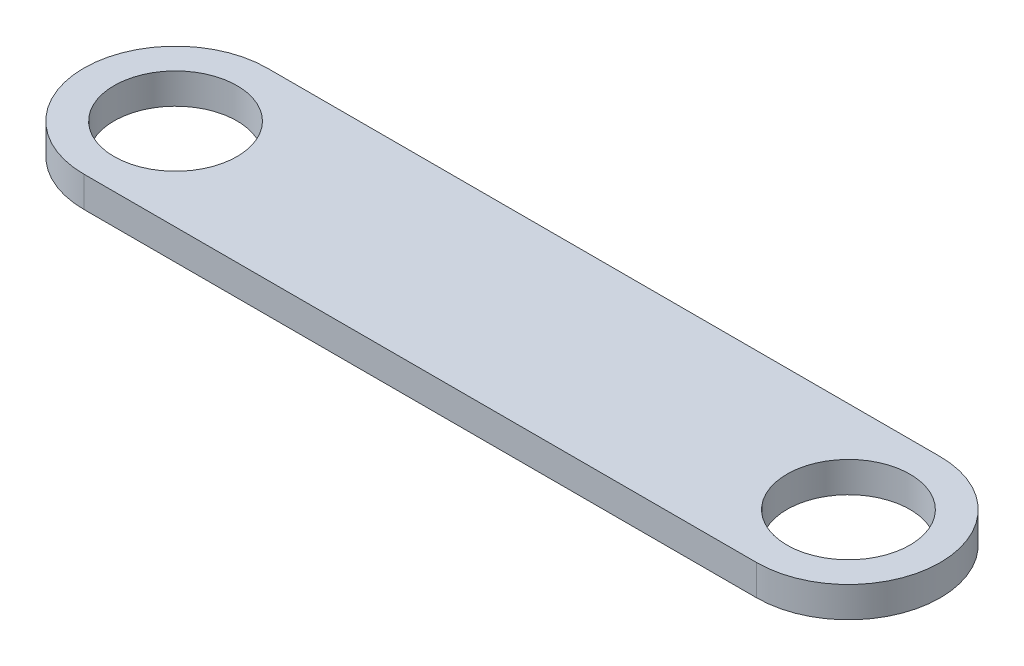
ISO-10303-21;
HEADER;
FILE_DESCRIPTION(('STEP AP214'),'2;1');
FILE_NAME('part.step','',(''),(''),'','','');
FILE_SCHEMA(('AUTOMOTIVE_DESIGN { 1 0 10303 214 1 1 1 1 }'));
ENDSEC;
DATA;
#1=APPLICATION_CONTEXT('core data for automotive mechanical design processes');
#2=APPLICATION_PROTOCOL_DEFINITION('international standard','automotive_design',2000,#1);
#3=PRODUCT_CONTEXT('',#1,'mechanical');
#4=PRODUCT('Part','Part','',(#3));
#5=PRODUCT_RELATED_PRODUCT_CATEGORY('part','',(#4));
#6=PRODUCT_DEFINITION_FORMATION('','',#4);
#7=PRODUCT_DEFINITION_CONTEXT('part definition',#1,'design');
#8=PRODUCT_DEFINITION('design','',#6,#7);
#9=PRODUCT_DEFINITION_SHAPE('','',#8);
#10=(LENGTH_UNIT() NAMED_UNIT(*) SI_UNIT(.MILLI.,.METRE.));
#11=(NAMED_UNIT(*) PLANE_ANGLE_UNIT() SI_UNIT($,.RADIAN.));
#12=(NAMED_UNIT(*) SI_UNIT($,.STERADIAN.) SOLID_ANGLE_UNIT());
#13=UNCERTAINTY_MEASURE_WITH_UNIT(LENGTH_MEASURE(1.E-05),#10,'distance_accuracy_value','');
#14=(GEOMETRIC_REPRESENTATION_CONTEXT(3) GLOBAL_UNCERTAINTY_ASSIGNED_CONTEXT((#13)) GLOBAL_UNIT_ASSIGNED_CONTEXT((#10,
#11,#12)) REPRESENTATION_CONTEXT('',''));
#15=CARTESIAN_POINT('',(0.,0.,0.));
#16=DIRECTION('',(0.,0.,1.));
#17=DIRECTION('',(1.,0.,0.));
#18=AXIS2_PLACEMENT_3D('',#15,#16,#17);
#19=CARTESIAN_POINT('',(0.,2.5,7.49999999999999));
#20=DIRECTION('',(0.,0.,-1.));
#21=DIRECTION('',(-1.,0.,0.));
#22=AXIS2_PLACEMENT_3D('',#19,#20,#21);
#23=PLANE('',#22);
#24=DIRECTION('',(1.,0.,0.));
#25=VECTOR('',#24,1.);
#26=CARTESIAN_POINT('',(0.,0.,7.49999999999999));
#27=LINE('',#26,#25);
#28=CARTESIAN_POINT('',(-27.5,0.,7.5));
#29=VERTEX_POINT('',#28);
#30=CARTESIAN_POINT('',(27.5,0.,7.49999999999999));
#31=VERTEX_POINT('',#30);
#32=EDGE_CURVE('E121',#29,#31,#27,.T.);
#33=ORIENTED_EDGE('',*,*,#32,.T.);
#34=DIRECTION('',(0.,-1.,0.));
#35=VECTOR('',#34,1.);
#36=CARTESIAN_POINT('',(27.5,2.5,7.49999999999999));
#37=LINE('',#36,#35);
#38=CARTESIAN_POINT('',(27.5,2.5,7.49999999999999));
#39=VERTEX_POINT('',#38);
#40=EDGE_CURVE('E11',#39,#31,#37,.T.);
#41=ORIENTED_EDGE('',*,*,#40,.F.);
#42=DIRECTION('',(1.,0.,0.));
#43=VECTOR('',#42,1.);
#44=CARTESIAN_POINT('',(0.,2.5,7.49999999999999));
#45=LINE('',#44,#43);
#46=CARTESIAN_POINT('',(-27.5,2.5,7.5));
#47=VERTEX_POINT('',#46);
#48=EDGE_CURVE('E94',#47,#39,#45,.T.);
#49=ORIENTED_EDGE('',*,*,#48,.F.);
#50=DIRECTION('',(0.,-1.,0.));
#51=VECTOR('',#50,1.);
#52=CARTESIAN_POINT('',(-27.5,2.5,7.5));
#53=LINE('',#52,#51);
#54=EDGE_CURVE('E109',#47,#29,#53,.T.);
#55=ORIENTED_EDGE('',*,*,#54,.T.);
#56=EDGE_LOOP('',(#33,#41,#49,#55));
#57=FACE_BOUND('',#56,.T.);
#58=ADVANCED_FACE('F45',(#57),#23,.F.);
#59=CARTESIAN_POINT('',(27.5,2.5,0.));
#60=DIRECTION('',(0.,-1.,0.));
#61=DIRECTION('',(0.,0.,-1.));
#62=AXIS2_PLACEMENT_3D('',#59,#60,#61);
#63=CYLINDRICAL_SURFACE('',#62,7.5);
#64=CARTESIAN_POINT('',(27.5,0.,0.));
#65=DIRECTION('',(0.,1.,0.));
#66=DIRECTION('',(0.,0.,1.));
#67=AXIS2_PLACEMENT_3D('',#64,#65,#66);
#68=CIRCLE('',#67,7.5);
#69=CARTESIAN_POINT('',(27.5,0.,-7.50000000000001));
#70=VERTEX_POINT('',#69);
#71=EDGE_CURVE('E100',#31,#70,#68,.T.);
#72=ORIENTED_EDGE('',*,*,#71,.T.);
#73=DIRECTION('',(0.,-1.,0.));
#74=VECTOR('',#73,1.);
#75=CARTESIAN_POINT('',(27.5,2.5,-7.50000000000001));
#76=LINE('',#75,#74);
#77=CARTESIAN_POINT('',(27.5,2.5,-7.50000000000001));
#78=VERTEX_POINT('',#77);
#79=EDGE_CURVE('E55',#78,#70,#76,.T.);
#80=ORIENTED_EDGE('',*,*,#79,.F.);
#81=CARTESIAN_POINT('',(27.5,2.5,0.));
#82=DIRECTION('',(0.,1.,0.));
#83=DIRECTION('',(0.,0.,1.));
#84=AXIS2_PLACEMENT_3D('',#81,#82,#83);
#85=CIRCLE('',#84,7.5);
#86=EDGE_CURVE('E89',#39,#78,#85,.T.);
#87=ORIENTED_EDGE('',*,*,#86,.F.);
#88=ORIENTED_EDGE('',*,*,#40,.T.);
#89=EDGE_LOOP('',(#72,#80,#87,#88));
#90=FACE_BOUND('',#89,.T.);
#91=ADVANCED_FACE('F99',(#90),#63,.T.);
#92=CARTESIAN_POINT('',(0.,2.5,-7.50000000000001));
#93=DIRECTION('',(0.,0.,-1.));
#94=DIRECTION('',(-1.,0.,0.));
#95=AXIS2_PLACEMENT_3D('',#92,#93,#94);
#96=PLANE('',#95);
#97=DIRECTION('',(1.,0.,0.));
#98=VECTOR('',#97,1.);
#99=CARTESIAN_POINT('',(0.,0.,-7.50000000000001));
#100=LINE('',#99,#98);
#101=CARTESIAN_POINT('',(-27.5,0.,-7.5));
#102=VERTEX_POINT('',#101);
#103=EDGE_CURVE('E127',#102,#70,#100,.T.);
#104=ORIENTED_EDGE('',*,*,#103,.F.);
#105=DIRECTION('',(0.,-1.,0.));
#106=VECTOR('',#105,1.);
#107=CARTESIAN_POINT('',(-27.5,2.5,-7.5));
#108=LINE('',#107,#106);
#109=CARTESIAN_POINT('',(-27.5,2.5,-7.5));
#110=VERTEX_POINT('',#109);
#111=EDGE_CURVE('E79',#110,#102,#108,.T.);
#112=ORIENTED_EDGE('',*,*,#111,.F.);
#113=DIRECTION('',(1.,0.,0.));
#114=VECTOR('',#113,1.);
#115=CARTESIAN_POINT('',(0.,2.5,-7.50000000000001));
#116=LINE('',#115,#114);
#117=EDGE_CURVE('E92',#110,#78,#116,.T.);
#118=ORIENTED_EDGE('',*,*,#117,.T.);
#119=ORIENTED_EDGE('',*,*,#79,.T.);
#120=EDGE_LOOP('',(#104,#112,#118,#119));
#121=FACE_BOUND('',#120,.T.);
#122=ADVANCED_FACE('F105',(#121),#96,.T.);
#123=CARTESIAN_POINT('',(-27.5,2.5,0.));
#124=DIRECTION('',(0.,-1.,0.));
#125=DIRECTION('',(0.,0.,-1.));
#126=AXIS2_PLACEMENT_3D('',#123,#124,#125);
#127=CYLINDRICAL_SURFACE('',#126,5.025);
#128=CARTESIAN_POINT('',(-27.5,2.5,0.));
#129=DIRECTION('',(0.,1.,0.));
#130=DIRECTION('',(0.,0.,1.));
#131=AXIS2_PLACEMENT_3D('',#128,#129,#130);
#132=CIRCLE('',#131,5.025);
#133=CARTESIAN_POINT('',(-27.5,2.5,5.025));
#134=VERTEX_POINT('',#133);
#135=EDGE_CURVE('E169',#134,#134,#132,.T.);
#136=ORIENTED_EDGE('',*,*,#135,.T.);
#137=EDGE_LOOP('',(#136));
#138=FACE_BOUND('',#137,.T.);
#139=CARTESIAN_POINT('',(-27.5,0.,0.));
#140=DIRECTION('',(0.,1.,0.));
#141=DIRECTION('',(0.,0.,1.));
#142=AXIS2_PLACEMENT_3D('',#139,#140,#141);
#143=CIRCLE('',#142,5.025);
#144=CARTESIAN_POINT('',(-27.5,0.,5.025));
#145=VERTEX_POINT('',#144);
#146=EDGE_CURVE('E117',#145,#145,#143,.T.);
#147=ORIENTED_EDGE('',*,*,#146,.F.);
#148=EDGE_LOOP('',(#147));
#149=FACE_BOUND('',#148,.T.);
#150=ADVANCED_FACE('F158',(#138,#149),#127,.F.);
#151=CARTESIAN_POINT('',(27.5,2.5,0.));
#152=DIRECTION('',(0.,-1.,0.));
#153=DIRECTION('',(0.,0.,-1.));
#154=AXIS2_PLACEMENT_3D('',#151,#152,#153);
#155=CYLINDRICAL_SURFACE('',#154,5.025);
#156=CARTESIAN_POINT('',(27.5,2.5,0.));
#157=DIRECTION('',(0.,1.,0.));
#158=DIRECTION('',(0.,0.,1.));
#159=AXIS2_PLACEMENT_3D('',#156,#157,#158);
#160=CIRCLE('',#159,5.025);
#161=CARTESIAN_POINT('',(27.5,2.5,5.02499999999999));
#162=VERTEX_POINT('',#161);
#163=EDGE_CURVE('E132',#162,#162,#160,.T.);
#164=ORIENTED_EDGE('',*,*,#163,.T.);
#165=EDGE_LOOP('',(#164));
#166=FACE_BOUND('',#165,.T.);
#167=CARTESIAN_POINT('',(27.5,0.,0.));
#168=DIRECTION('',(0.,1.,0.));
#169=DIRECTION('',(0.,0.,1.));
#170=AXIS2_PLACEMENT_3D('',#167,#168,#169);
#171=CIRCLE('',#170,5.025);
#172=CARTESIAN_POINT('',(27.5,0.,5.02499999999999));
#173=VERTEX_POINT('',#172);
#174=EDGE_CURVE('E113',#173,#173,#171,.T.);
#175=ORIENTED_EDGE('',*,*,#174,.F.);
#176=EDGE_LOOP('',(#175));
#177=FACE_BOUND('',#176,.T.);
#178=ADVANCED_FACE('F47',(#166,#177),#155,.F.);
#179=CARTESIAN_POINT('',(-27.5,2.5,0.));
#180=DIRECTION('',(0.,-1.,0.));
#181=DIRECTION('',(0.,0.,-1.));
#182=AXIS2_PLACEMENT_3D('',#179,#180,#181);
#183=CYLINDRICAL_SURFACE('',#182,7.5);
#184=CARTESIAN_POINT('',(-27.5,0.,0.));
#185=DIRECTION('',(0.,1.,0.));
#186=DIRECTION('',(0.,0.,1.));
#187=AXIS2_PLACEMENT_3D('',#184,#185,#186);
#188=CIRCLE('',#187,7.5);
#189=EDGE_CURVE('E82',#102,#29,#188,.T.);
#190=ORIENTED_EDGE('',*,*,#189,.T.);
#191=ORIENTED_EDGE('',*,*,#54,.F.);
#192=CARTESIAN_POINT('',(-27.5,2.5,0.));
#193=DIRECTION('',(0.,1.,0.));
#194=DIRECTION('',(0.,0.,1.));
#195=AXIS2_PLACEMENT_3D('',#192,#193,#194);
#196=CIRCLE('',#195,7.5);
#197=EDGE_CURVE('E63',#110,#47,#196,.T.);
#198=ORIENTED_EDGE('',*,*,#197,.F.);
#199=ORIENTED_EDGE('',*,*,#111,.T.);
#200=EDGE_LOOP('',(#190,#191,#198,#199));
#201=FACE_BOUND('',#200,.T.);
#202=ADVANCED_FACE('F146',(#201),#183,.T.);
#203=CARTESIAN_POINT('',(0.,2.5,0.));
#204=DIRECTION('',(0.,1.,0.));
#205=DIRECTION('',(0.,0.,1.));
#206=AXIS2_PLACEMENT_3D('',#203,#204,#205);
#207=PLANE('',#206);
#208=ORIENTED_EDGE('',*,*,#163,.F.);
#209=EDGE_LOOP('',(#208));
#210=FACE_BOUND('',#209,.T.);
#211=ORIENTED_EDGE('',*,*,#135,.F.);
#212=EDGE_LOOP('',(#211));
#213=FACE_BOUND('',#212,.T.);
#214=ORIENTED_EDGE('',*,*,#48,.T.);
#215=ORIENTED_EDGE('',*,*,#86,.T.);
#216=ORIENTED_EDGE('',*,*,#117,.F.);
#217=ORIENTED_EDGE('',*,*,#197,.T.);
#218=EDGE_LOOP('',(#214,#215,#216,#217));
#219=FACE_BOUND('',#218,.T.);
#220=ADVANCED_FACE('F90',(#210,#213,#219),#207,.T.);
#221=CARTESIAN_POINT('',(0.,0.,0.));
#222=DIRECTION('',(0.,1.,0.));
#223=DIRECTION('',(0.,0.,1.));
#224=AXIS2_PLACEMENT_3D('',#221,#222,#223);
#225=PLANE('',#224);
#226=ORIENTED_EDGE('',*,*,#174,.T.);
#227=EDGE_LOOP('',(#226));
#228=FACE_BOUND('',#227,.T.);
#229=ORIENTED_EDGE('',*,*,#146,.T.);
#230=EDGE_LOOP('',(#229));
#231=FACE_BOUND('',#230,.T.);
#232=ORIENTED_EDGE('',*,*,#32,.F.);
#233=ORIENTED_EDGE('',*,*,#189,.F.);
#234=ORIENTED_EDGE('',*,*,#103,.T.);
#235=ORIENTED_EDGE('',*,*,#71,.F.);
#236=EDGE_LOOP('',(#232,#233,#234,#235));
#237=FACE_BOUND('',#236,.T.);
#238=ADVANCED_FACE('F139',(#228,#231,#237),#225,.F.);
#239=CLOSED_SHELL('',(#58,#91,#122,#150,#178,#202,#220,#238));
#240=MANIFOLD_SOLID_BREP('B2',#239);
#241=ADVANCED_BREP_SHAPE_REPRESENTATION('',(#18,#240),#14);
#242=SHAPE_DEFINITION_REPRESENTATION(#9,#241);
ENDSEC;
END-ISO-10303-21;
